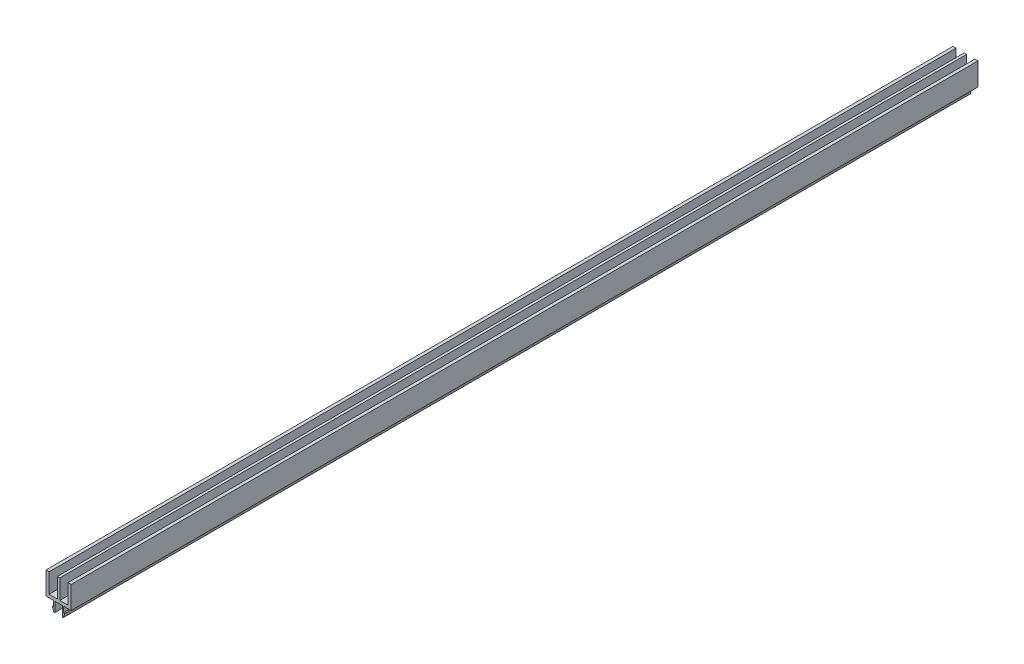
ISO-10303-21;
HEADER;
FILE_DESCRIPTION(('STEP AP214'),'2;1');
FILE_NAME('part.step','',(''),(''),'','','');
FILE_SCHEMA(('AUTOMOTIVE_DESIGN { 1 0 10303 214 1 1 1 1 }'));
ENDSEC;
DATA;
#1=APPLICATION_CONTEXT('core data for automotive mechanical design processes');
#2=APPLICATION_PROTOCOL_DEFINITION('international standard','automotive_design',2000,#1);
#3=PRODUCT_CONTEXT('',#1,'mechanical');
#4=PRODUCT('Part','Part','',(#3));
#5=PRODUCT_RELATED_PRODUCT_CATEGORY('part','',(#4));
#6=PRODUCT_DEFINITION_FORMATION('','',#4);
#7=PRODUCT_DEFINITION_CONTEXT('part definition',#1,'design');
#8=PRODUCT_DEFINITION('design','',#6,#7);
#9=PRODUCT_DEFINITION_SHAPE('','',#8);
#10=(LENGTH_UNIT() NAMED_UNIT(*) SI_UNIT(.MILLI.,.METRE.));
#11=(NAMED_UNIT(*) PLANE_ANGLE_UNIT() SI_UNIT($,.RADIAN.));
#12=(NAMED_UNIT(*) SI_UNIT($,.STERADIAN.) SOLID_ANGLE_UNIT());
#13=UNCERTAINTY_MEASURE_WITH_UNIT(LENGTH_MEASURE(1.E-05),#10,'distance_accuracy_value','');
#14=(GEOMETRIC_REPRESENTATION_CONTEXT(3) GLOBAL_UNCERTAINTY_ASSIGNED_CONTEXT((#13)) GLOBAL_UNIT_ASSIGNED_CONTEXT((#10,
#11,#12)) REPRESENTATION_CONTEXT('',''));
#15=CARTESIAN_POINT('',(0.,0.,0.));
#16=DIRECTION('',(0.,0.,1.));
#17=DIRECTION('',(1.,0.,0.));
#18=AXIS2_PLACEMENT_3D('',#15,#16,#17);
#19=CARTESIAN_POINT('',(-1.,17.9999999975,-672.));
#20=DIRECTION('',(-1.,0.,0.));
#21=DIRECTION('',(0.,-1.,0.));
#22=AXIS2_PLACEMENT_3D('',#19,#20,#21);
#23=PLANE('',#22);
#24=DIRECTION('',(0.,-1.,0.));
#25=VECTOR('',#24,1.);
#26=CARTESIAN_POINT('',(-1.,17.9999999975,50.));
#27=LINE('',#26,#25);
#28=CARTESIAN_POINT('',(-1.,17.9999999975,50.));
#29=VERTEX_POINT('',#28);
#30=CARTESIAN_POINT('',(-1.,2.4999999995,50.));
#31=VERTEX_POINT('',#30);
#32=EDGE_CURVE('E225',#29,#31,#27,.T.);
#33=ORIENTED_EDGE('',*,*,#32,.F.);
#34=DIRECTION('',(0.,0.,1.));
#35=VECTOR('',#34,1.);
#36=CARTESIAN_POINT('',(-1.,17.9999999975,-672.));
#37=LINE('',#36,#35);
#38=CARTESIAN_POINT('',(-1.,17.9999999975,-672.));
#39=VERTEX_POINT('',#38);
#40=EDGE_CURVE('E11',#39,#29,#37,.T.);
#41=ORIENTED_EDGE('',*,*,#40,.F.);
#42=DIRECTION('',(0.,-1.,0.));
#43=VECTOR('',#42,1.);
#44=CARTESIAN_POINT('',(-1.,17.9999999975,-672.));
#45=LINE('',#44,#43);
#46=CARTESIAN_POINT('',(-1.,2.4999999995,-672.));
#47=VERTEX_POINT('',#46);
#48=EDGE_CURVE('E293',#39,#47,#45,.T.);
#49=ORIENTED_EDGE('',*,*,#48,.T.);
#50=DIRECTION('',(0.,0.,1.));
#51=VECTOR('',#50,1.);
#52=CARTESIAN_POINT('',(-1.,2.4999999995,-672.));
#53=LINE('',#52,#51);
#54=EDGE_CURVE('E35',#47,#31,#53,.T.);
#55=ORIENTED_EDGE('',*,*,#54,.T.);
#56=EDGE_LOOP('',(#33,#41,#49,#55));
#57=FACE_BOUND('',#56,.T.);
#58=ADVANCED_FACE('F32',(#57),#23,.T.);
#59=CARTESIAN_POINT('',(0.999999999999998,17.9999999975,-672.));
#60=DIRECTION('',(0.,1.,0.));
#61=DIRECTION('',(0.,0.,1.));
#62=AXIS2_PLACEMENT_3D('',#59,#60,#61);
#63=PLANE('',#62);
#64=DIRECTION('',(-1.,0.,0.));
#65=VECTOR('',#64,1.);
#66=CARTESIAN_POINT('',(0.999999999999998,17.9999999975,50.));
#67=LINE('',#66,#65);
#68=CARTESIAN_POINT('',(0.999999999999998,17.9999999975,50.));
#69=VERTEX_POINT('',#68);
#70=EDGE_CURVE('E291',#69,#29,#67,.T.);
#71=ORIENTED_EDGE('',*,*,#70,.F.);
#72=DIRECTION('',(0.,0.,1.));
#73=VECTOR('',#72,1.);
#74=CARTESIAN_POINT('',(0.999999999999998,17.9999999975,-672.));
#75=LINE('',#74,#73);
#76=CARTESIAN_POINT('',(0.999999999999998,17.9999999975,-672.));
#77=VERTEX_POINT('',#76);
#78=EDGE_CURVE('E41',#77,#69,#75,.T.);
#79=ORIENTED_EDGE('',*,*,#78,.F.);
#80=DIRECTION('',(-1.,0.,0.));
#81=VECTOR('',#80,1.);
#82=CARTESIAN_POINT('',(0.999999999999998,17.9999999975,-672.));
#83=LINE('',#82,#81);
#84=EDGE_CURVE('E215',#77,#39,#83,.T.);
#85=ORIENTED_EDGE('',*,*,#84,.T.);
#86=ORIENTED_EDGE('',*,*,#40,.T.);
#87=EDGE_LOOP('',(#71,#79,#85,#86));
#88=FACE_BOUND('',#87,.T.);
#89=ADVANCED_FACE('F337',(#88),#63,.T.);
#90=CARTESIAN_POINT('',(0.999999999999998,2.4999999995,-672.));
#91=DIRECTION('',(1.,0.,0.));
#92=DIRECTION('',(0.,0.,-1.));
#93=AXIS2_PLACEMENT_3D('',#90,#91,#92);
#94=PLANE('',#93);
#95=DIRECTION('',(0.,1.,0.));
#96=VECTOR('',#95,1.);
#97=CARTESIAN_POINT('',(0.999999999999998,2.4999999995,50.));
#98=LINE('',#97,#96);
#99=CARTESIAN_POINT('',(0.999999999999998,2.4999999995,50.));
#100=VERTEX_POINT('',#99);
#101=EDGE_CURVE('E202',#100,#69,#98,.T.);
#102=ORIENTED_EDGE('',*,*,#101,.F.);
#103=DIRECTION('',(0.,0.,1.));
#104=VECTOR('',#103,1.);
#105=CARTESIAN_POINT('',(0.999999999999998,2.4999999995,-672.));
#106=LINE('',#105,#104);
#107=CARTESIAN_POINT('',(0.999999999999998,2.4999999995,-672.));
#108=VERTEX_POINT('',#107);
#109=EDGE_CURVE('E197',#108,#100,#106,.T.);
#110=ORIENTED_EDGE('',*,*,#109,.F.);
#111=DIRECTION('',(0.,1.,0.));
#112=VECTOR('',#111,1.);
#113=CARTESIAN_POINT('',(0.999999999999998,2.4999999995,-672.));
#114=LINE('',#113,#112);
#115=EDGE_CURVE('E200',#108,#77,#114,.T.);
#116=ORIENTED_EDGE('',*,*,#115,.T.);
#117=ORIENTED_EDGE('',*,*,#78,.T.);
#118=EDGE_LOOP('',(#102,#110,#116,#117));
#119=FACE_BOUND('',#118,.T.);
#120=ADVANCED_FACE('F199',(#119),#94,.T.);
#121=CARTESIAN_POINT('',(7.5,2.4999999995,-672.));
#122=DIRECTION('',(0.,1.,0.));
#123=DIRECTION('',(-1.,0.,0.));
#124=AXIS2_PLACEMENT_3D('',#121,#122,#123);
#125=PLANE('',#124);
#126=DIRECTION('',(-1.,0.,0.));
#127=VECTOR('',#126,1.);
#128=CARTESIAN_POINT('',(7.5,2.4999999995,50.));
#129=LINE('',#128,#127);
#130=CARTESIAN_POINT('',(7.5,2.4999999995,50.));
#131=VERTEX_POINT('',#130);
#132=EDGE_CURVE('E288',#131,#100,#129,.T.);
#133=ORIENTED_EDGE('',*,*,#132,.F.);
#134=DIRECTION('',(0.,0.,1.));
#135=VECTOR('',#134,1.);
#136=CARTESIAN_POINT('',(7.5,2.4999999995,-672.));
#137=LINE('',#136,#135);
#138=CARTESIAN_POINT('',(7.5,2.4999999995,-672.));
#139=VERTEX_POINT('',#138);
#140=EDGE_CURVE('E207',#139,#131,#137,.T.);
#141=ORIENTED_EDGE('',*,*,#140,.F.);
#142=DIRECTION('',(-1.,0.,0.));
#143=VECTOR('',#142,1.);
#144=CARTESIAN_POINT('',(7.5,2.4999999995,-672.));
#145=LINE('',#144,#143);
#146=EDGE_CURVE('E213',#139,#108,#145,.T.);
#147=ORIENTED_EDGE('',*,*,#146,.T.);
#148=ORIENTED_EDGE('',*,*,#109,.T.);
#149=EDGE_LOOP('',(#133,#141,#147,#148));
#150=FACE_BOUND('',#149,.T.);
#151=ADVANCED_FACE('F217',(#150),#125,.T.);
#152=CARTESIAN_POINT('',(7.5,17.9999999975,-672.));
#153=DIRECTION('',(-1.,0.,0.));
#154=DIRECTION('',(0.,-1.,0.));
#155=AXIS2_PLACEMENT_3D('',#152,#153,#154);
#156=PLANE('',#155);
#157=DIRECTION('',(0.,-1.,0.));
#158=VECTOR('',#157,1.);
#159=CARTESIAN_POINT('',(7.5,17.9999999975,50.));
#160=LINE('',#159,#158);
#161=CARTESIAN_POINT('',(7.5,17.9999999975,50.));
#162=VERTEX_POINT('',#161);
#163=EDGE_CURVE('E285',#162,#131,#160,.T.);
#164=ORIENTED_EDGE('',*,*,#163,.F.);
#165=DIRECTION('',(0.,0.,1.));
#166=VECTOR('',#165,1.);
#167=CARTESIAN_POINT('',(7.5,17.9999999975,-672.));
#168=LINE('',#167,#166);
#169=CARTESIAN_POINT('',(7.5,17.9999999975,-672.));
#170=VERTEX_POINT('',#169);
#171=EDGE_CURVE('E297',#170,#162,#168,.T.);
#172=ORIENTED_EDGE('',*,*,#171,.F.);
#173=DIRECTION('',(0.,-1.,0.));
#174=VECTOR('',#173,1.);
#175=CARTESIAN_POINT('',(7.5,17.9999999975,-672.));
#176=LINE('',#175,#174);
#177=EDGE_CURVE('E218',#170,#139,#176,.T.);
#178=ORIENTED_EDGE('',*,*,#177,.T.);
#179=ORIENTED_EDGE('',*,*,#140,.T.);
#180=EDGE_LOOP('',(#164,#172,#178,#179));
#181=FACE_BOUND('',#180,.T.);
#182=ADVANCED_FACE('F350',(#181),#156,.T.);
#183=CARTESIAN_POINT('',(10.,17.9999999975,-672.));
#184=DIRECTION('',(0.,1.,0.));
#185=DIRECTION('',(0.,0.,1.));
#186=AXIS2_PLACEMENT_3D('',#183,#184,#185);
#187=PLANE('',#186);
#188=DIRECTION('',(-1.,0.,0.));
#189=VECTOR('',#188,1.);
#190=CARTESIAN_POINT('',(10.,17.9999999975,50.));
#191=LINE('',#190,#189);
#192=CARTESIAN_POINT('',(10.,17.9999999975,50.));
#193=VERTEX_POINT('',#192);
#194=EDGE_CURVE('E282',#193,#162,#191,.T.);
#195=ORIENTED_EDGE('',*,*,#194,.F.);
#196=DIRECTION('',(0.,0.,1.));
#197=VECTOR('',#196,1.);
#198=CARTESIAN_POINT('',(10.,17.9999999975,-672.));
#199=LINE('',#198,#197);
#200=CARTESIAN_POINT('',(10.,17.9999999975,-672.));
#201=VERTEX_POINT('',#200);
#202=EDGE_CURVE('E299',#201,#193,#199,.T.);
#203=ORIENTED_EDGE('',*,*,#202,.F.);
#204=DIRECTION('',(-1.,0.,0.));
#205=VECTOR('',#204,1.);
#206=CARTESIAN_POINT('',(10.,17.9999999975,-672.));
#207=LINE('',#206,#205);
#208=EDGE_CURVE('E220',#201,#170,#207,.T.);
#209=ORIENTED_EDGE('',*,*,#208,.T.);
#210=ORIENTED_EDGE('',*,*,#171,.T.);
#211=EDGE_LOOP('',(#195,#203,#209,#210));
#212=FACE_BOUND('',#211,.T.);
#213=ADVANCED_FACE('F353',(#212),#187,.T.);
#214=CARTESIAN_POINT('',(10.,-4.99999828349541E-10,-672.));
#215=DIRECTION('',(1.,0.,0.));
#216=DIRECTION('',(0.,0.,-1.));
#217=AXIS2_PLACEMENT_3D('',#214,#215,#216);
#218=PLANE('',#217);
#219=DIRECTION('',(0.,1.,0.));
#220=VECTOR('',#219,1.);
#221=CARTESIAN_POINT('',(10.,-4.99999828349541E-10,50.));
#222=LINE('',#221,#220);
#223=CARTESIAN_POINT('',(10.,-4.99999828349541E-10,50.));
#224=VERTEX_POINT('',#223);
#225=EDGE_CURVE('E279',#224,#193,#222,.T.);
#226=ORIENTED_EDGE('',*,*,#225,.F.);
#227=DIRECTION('',(0.,0.,1.));
#228=VECTOR('',#227,1.);
#229=CARTESIAN_POINT('',(10.,-4.99999828349541E-10,-672.));
#230=LINE('',#229,#228);
#231=CARTESIAN_POINT('',(10.,-4.99999828349541E-10,-672.));
#232=VERTEX_POINT('',#231);
#233=EDGE_CURVE('E301',#232,#224,#230,.T.);
#234=ORIENTED_EDGE('',*,*,#233,.F.);
#235=DIRECTION('',(0.,1.,0.));
#236=VECTOR('',#235,1.);
#237=CARTESIAN_POINT('',(10.,-4.99999828349541E-10,-672.));
#238=LINE('',#237,#236);
#239=EDGE_CURVE('E643',#232,#201,#238,.T.);
#240=ORIENTED_EDGE('',*,*,#239,.T.);
#241=ORIENTED_EDGE('',*,*,#202,.T.);
#242=EDGE_LOOP('',(#226,#234,#240,#241));
#243=FACE_BOUND('',#242,.T.);
#244=ADVANCED_FACE('F357',(#243),#218,.T.);
#245=CARTESIAN_POINT('',(4.,-4.99999998002099E-10,-672.));
#246=DIRECTION('',(0.,-1.,0.));
#247=DIRECTION('',(1.,0.,0.));
#248=AXIS2_PLACEMENT_3D('',#245,#246,#247);
#249=PLANE('',#248);
#250=DIRECTION('',(1.,0.,0.));
#251=VECTOR('',#250,1.);
#252=CARTESIAN_POINT('',(4.,-4.99999998002099E-10,50.));
#253=LINE('',#252,#251);
#254=CARTESIAN_POINT('',(4.,-4.99999998002099E-10,50.));
#255=VERTEX_POINT('',#254);
#256=EDGE_CURVE('E276',#255,#224,#253,.T.);
#257=ORIENTED_EDGE('',*,*,#256,.F.);
#258=DIRECTION('',(0.,0.,1.));
#259=VECTOR('',#258,1.);
#260=CARTESIAN_POINT('',(4.,-4.99999998002099E-10,-672.));
#261=LINE('',#260,#259);
#262=CARTESIAN_POINT('',(4.,-4.99999998002099E-10,-672.));
#263=VERTEX_POINT('',#262);
#264=EDGE_CURVE('E303',#263,#255,#261,.T.);
#265=ORIENTED_EDGE('',*,*,#264,.F.);
#266=DIRECTION('',(1.,0.,0.));
#267=VECTOR('',#266,1.);
#268=CARTESIAN_POINT('',(4.,-4.99999998002099E-10,-672.));
#269=LINE('',#268,#267);
#270=EDGE_CURVE('E647',#263,#232,#269,.T.);
#271=ORIENTED_EDGE('',*,*,#270,.T.);
#272=ORIENTED_EDGE('',*,*,#233,.T.);
#273=EDGE_LOOP('',(#257,#265,#271,#272));
#274=FACE_BOUND('',#273,.T.);
#275=ADVANCED_FACE('F361',(#274),#249,.T.);
#276=CARTESIAN_POINT('',(4.,-4.5,-672.));
#277=DIRECTION('',(1.,0.,0.));
#278=DIRECTION('',(0.,0.,-1.));
#279=AXIS2_PLACEMENT_3D('',#276,#277,#278);
#280=PLANE('',#279);
#281=DIRECTION('',(0.,1.,0.));
#282=VECTOR('',#281,1.);
#283=CARTESIAN_POINT('',(4.,-4.5,50.));
#284=LINE('',#283,#282);
#285=CARTESIAN_POINT('',(4.,-4.5,50.));
#286=VERTEX_POINT('',#285);
#287=EDGE_CURVE('E273',#286,#255,#284,.T.);
#288=ORIENTED_EDGE('',*,*,#287,.F.);
#289=DIRECTION('',(0.,0.,1.));
#290=VECTOR('',#289,1.);
#291=CARTESIAN_POINT('',(4.,-4.5,-672.));
#292=LINE('',#291,#290);
#293=CARTESIAN_POINT('',(4.,-4.5,-672.));
#294=VERTEX_POINT('',#293);
#295=EDGE_CURVE('E305',#294,#286,#292,.T.);
#296=ORIENTED_EDGE('',*,*,#295,.F.);
#297=DIRECTION('',(0.,1.,0.));
#298=VECTOR('',#297,1.);
#299=CARTESIAN_POINT('',(4.,-4.5,-672.));
#300=LINE('',#299,#298);
#301=EDGE_CURVE('E636',#294,#263,#300,.T.);
#302=ORIENTED_EDGE('',*,*,#301,.T.);
#303=ORIENTED_EDGE('',*,*,#264,.T.);
#304=EDGE_LOOP('',(#288,#296,#302,#303));
#305=FACE_BOUND('',#304,.T.);
#306=ADVANCED_FACE('F365',(#305),#280,.T.);
#307=CARTESIAN_POINT('',(5.,-4.5,-672.));
#308=DIRECTION('',(0.,1.,0.));
#309=DIRECTION('',(0.,0.,1.));
#310=AXIS2_PLACEMENT_3D('',#307,#308,#309);
#311=PLANE('',#310);
#312=DIRECTION('',(-1.,0.,0.));
#313=VECTOR('',#312,1.);
#314=CARTESIAN_POINT('',(5.,-4.5,50.));
#315=LINE('',#314,#313);
#316=CARTESIAN_POINT('',(5.,-4.5,50.));
#317=VERTEX_POINT('',#316);
#318=EDGE_CURVE('E270',#317,#286,#315,.T.);
#319=ORIENTED_EDGE('',*,*,#318,.F.);
#320=DIRECTION('',(0.,0.,1.));
#321=VECTOR('',#320,1.);
#322=CARTESIAN_POINT('',(5.,-4.5,-672.));
#323=LINE('',#322,#321);
#324=CARTESIAN_POINT('',(5.,-4.5,-672.));
#325=VERTEX_POINT('',#324);
#326=EDGE_CURVE('E307',#325,#317,#323,.T.);
#327=ORIENTED_EDGE('',*,*,#326,.F.);
#328=DIRECTION('',(-1.,0.,0.));
#329=VECTOR('',#328,1.);
#330=CARTESIAN_POINT('',(5.,-4.5,-672.));
#331=LINE('',#330,#329);
#332=EDGE_CURVE('E632',#325,#294,#331,.T.);
#333=ORIENTED_EDGE('',*,*,#332,.T.);
#334=ORIENTED_EDGE('',*,*,#295,.T.);
#335=EDGE_LOOP('',(#319,#327,#333,#334));
#336=FACE_BOUND('',#335,.T.);
#337=ADVANCED_FACE('F369',(#336),#311,.T.);
#338=CARTESIAN_POINT('',(3.75,-8.,-672.));
#339=DIRECTION('',(0.941741911594837,-0.336336396998156,0.));
#340=DIRECTION('',(0.336336396998157,0.941741911594838,0.));
#341=AXIS2_PLACEMENT_3D('',#338,#339,#340);
#342=PLANE('',#341);
#343=DIRECTION('',(0.336336396998157,0.941741911594837,0.));
#344=VECTOR('',#343,1.);
#345=CARTESIAN_POINT('',(3.75,-8.,50.));
#346=LINE('',#345,#344);
#347=CARTESIAN_POINT('',(3.75,-8.,50.));
#348=VERTEX_POINT('',#347);
#349=EDGE_CURVE('E267',#348,#317,#346,.T.);
#350=ORIENTED_EDGE('',*,*,#349,.F.);
#351=DIRECTION('',(0.,0.,1.));
#352=VECTOR('',#351,1.);
#353=CARTESIAN_POINT('',(3.75,-8.,-672.));
#354=LINE('',#353,#352);
#355=CARTESIAN_POINT('',(3.75,-8.,-672.));
#356=VERTEX_POINT('',#355);
#357=EDGE_CURVE('E309',#356,#348,#354,.T.);
#358=ORIENTED_EDGE('',*,*,#357,.F.);
#359=DIRECTION('',(0.336336396998157,0.941741911594837,0.));
#360=VECTOR('',#359,1.);
#361=CARTESIAN_POINT('',(3.75,-8.,-672.));
#362=LINE('',#361,#360);
#363=EDGE_CURVE('E653',#356,#325,#362,.T.);
#364=ORIENTED_EDGE('',*,*,#363,.T.);
#365=ORIENTED_EDGE('',*,*,#326,.T.);
#366=EDGE_LOOP('',(#350,#358,#364,#365));
#367=FACE_BOUND('',#366,.T.);
#368=ADVANCED_FACE('F373',(#367),#342,.T.);
#369=CARTESIAN_POINT('',(3.,-8.,-672.));
#370=DIRECTION('',(0.,-1.,0.));
#371=DIRECTION('',(0.,0.,-1.));
#372=AXIS2_PLACEMENT_3D('',#369,#370,#371);
#373=PLANE('',#372);
#374=DIRECTION('',(1.,0.,0.));
#375=VECTOR('',#374,1.);
#376=CARTESIAN_POINT('',(3.,-8.,50.));
#377=LINE('',#376,#375);
#378=CARTESIAN_POINT('',(3.,-8.,50.));
#379=VERTEX_POINT('',#378);
#380=EDGE_CURVE('E264',#379,#348,#377,.T.);
#381=ORIENTED_EDGE('',*,*,#380,.F.);
#382=DIRECTION('',(0.,0.,1.));
#383=VECTOR('',#382,1.);
#384=CARTESIAN_POINT('',(3.,-8.,-672.));
#385=LINE('',#384,#383);
#386=CARTESIAN_POINT('',(3.,-8.,-672.));
#387=VERTEX_POINT('',#386);
#388=EDGE_CURVE('E311',#387,#379,#385,.T.);
#389=ORIENTED_EDGE('',*,*,#388,.F.);
#390=DIRECTION('',(1.,0.,0.));
#391=VECTOR('',#390,1.);
#392=CARTESIAN_POINT('',(3.,-8.,-672.));
#393=LINE('',#392,#391);
#394=EDGE_CURVE('E625',#387,#356,#393,.T.);
#395=ORIENTED_EDGE('',*,*,#394,.T.);
#396=ORIENTED_EDGE('',*,*,#357,.T.);
#397=EDGE_LOOP('',(#381,#389,#395,#396));
#398=FACE_BOUND('',#397,.T.);
#399=ADVANCED_FACE('F377',(#398),#373,.T.);
#400=CARTESIAN_POINT('',(3.,-4.9999985194348E-10,-672.));
#401=DIRECTION('',(-1.,0.,0.));
#402=DIRECTION('',(0.,0.,1.));
#403=AXIS2_PLACEMENT_3D('',#400,#401,#402);
#404=PLANE('',#403);
#405=DIRECTION('',(0.,-1.,0.));
#406=VECTOR('',#405,1.);
#407=CARTESIAN_POINT('',(3.,-4.9999985194348E-10,50.));
#408=LINE('',#407,#406);
#409=CARTESIAN_POINT('',(3.,-4.9999985194348E-10,50.));
#410=VERTEX_POINT('',#409);
#411=EDGE_CURVE('E261',#410,#379,#408,.T.);
#412=ORIENTED_EDGE('',*,*,#411,.F.);
#413=DIRECTION('',(0.,0.,1.));
#414=VECTOR('',#413,1.);
#415=CARTESIAN_POINT('',(3.,-4.9999985194348E-10,-672.));
#416=LINE('',#415,#414);
#417=CARTESIAN_POINT('',(3.,-4.9999985194348E-10,-672.));
#418=VERTEX_POINT('',#417);
#419=EDGE_CURVE('E313',#418,#410,#416,.T.);
#420=ORIENTED_EDGE('',*,*,#419,.F.);
#421=DIRECTION('',(0.,-1.,0.));
#422=VECTOR('',#421,1.);
#423=CARTESIAN_POINT('',(3.,-4.9999985194348E-10,-672.));
#424=LINE('',#423,#422);
#425=EDGE_CURVE('E621',#418,#387,#424,.T.);
#426=ORIENTED_EDGE('',*,*,#425,.T.);
#427=ORIENTED_EDGE('',*,*,#388,.T.);
#428=EDGE_LOOP('',(#412,#420,#426,#427));
#429=FACE_BOUND('',#428,.T.);
#430=ADVANCED_FACE('F381',(#429),#404,.T.);
#431=CARTESIAN_POINT('',(-3.,-4.99999455901012E-10,-672.));
#432=DIRECTION('',(0.,-1.,0.));
#433=DIRECTION('',(1.,0.,0.));
#434=AXIS2_PLACEMENT_3D('',#431,#432,#433);
#435=PLANE('',#434);
#436=DIRECTION('',(1.,0.,0.));
#437=VECTOR('',#436,1.);
#438=CARTESIAN_POINT('',(-3.,-4.99999455901012E-10,50.));
#439=LINE('',#438,#437);
#440=CARTESIAN_POINT('',(-3.,-4.99999455901012E-10,50.));
#441=VERTEX_POINT('',#440);
#442=EDGE_CURVE('E258',#441,#410,#439,.T.);
#443=ORIENTED_EDGE('',*,*,#442,.F.);
#444=DIRECTION('',(0.,0.,1.));
#445=VECTOR('',#444,1.);
#446=CARTESIAN_POINT('',(-3.,-4.99999455901012E-10,-672.));
#447=LINE('',#446,#445);
#448=CARTESIAN_POINT('',(-3.,-4.99999455901012E-10,-672.));
#449=VERTEX_POINT('',#448);
#450=EDGE_CURVE('E315',#449,#441,#447,.T.);
#451=ORIENTED_EDGE('',*,*,#450,.F.);
#452=DIRECTION('',(1.,0.,0.));
#453=VECTOR('',#452,1.);
#454=CARTESIAN_POINT('',(-3.,-4.99999455901012E-10,-672.));
#455=LINE('',#454,#453);
#456=EDGE_CURVE('E657',#449,#418,#455,.T.);
#457=ORIENTED_EDGE('',*,*,#456,.T.);
#458=ORIENTED_EDGE('',*,*,#419,.T.);
#459=EDGE_LOOP('',(#443,#451,#457,#458));
#460=FACE_BOUND('',#459,.T.);
#461=ADVANCED_FACE('F385',(#460),#435,.T.);
#462=CARTESIAN_POINT('',(-3.,-8.,-672.));
#463=DIRECTION('',(1.,0.,0.));
#464=DIRECTION('',(0.,0.,-1.));
#465=AXIS2_PLACEMENT_3D('',#462,#463,#464);
#466=PLANE('',#465);
#467=DIRECTION('',(0.,1.,0.));
#468=VECTOR('',#467,1.);
#469=CARTESIAN_POINT('',(-3.,-8.,50.));
#470=LINE('',#469,#468);
#471=CARTESIAN_POINT('',(-3.,-8.,50.));
#472=VERTEX_POINT('',#471);
#473=EDGE_CURVE('E255',#472,#441,#470,.T.);
#474=ORIENTED_EDGE('',*,*,#473,.F.);
#475=DIRECTION('',(0.,0.,1.));
#476=VECTOR('',#475,1.);
#477=CARTESIAN_POINT('',(-3.,-8.,-672.));
#478=LINE('',#477,#476);
#479=CARTESIAN_POINT('',(-3.,-8.,-672.));
#480=VERTEX_POINT('',#479);
#481=EDGE_CURVE('E317',#480,#472,#478,.T.);
#482=ORIENTED_EDGE('',*,*,#481,.F.);
#483=DIRECTION('',(0.,1.,0.));
#484=VECTOR('',#483,1.);
#485=CARTESIAN_POINT('',(-3.,-8.,-672.));
#486=LINE('',#485,#484);
#487=EDGE_CURVE('E614',#480,#449,#486,.T.);
#488=ORIENTED_EDGE('',*,*,#487,.T.);
#489=ORIENTED_EDGE('',*,*,#450,.T.);
#490=EDGE_LOOP('',(#474,#482,#488,#489));
#491=FACE_BOUND('',#490,.T.);
#492=ADVANCED_FACE('F389',(#491),#466,.T.);
#493=CARTESIAN_POINT('',(-3.75,-8.,-672.));
#494=DIRECTION('',(0.,-1.,0.));
#495=DIRECTION('',(0.,0.,-1.));
#496=AXIS2_PLACEMENT_3D('',#493,#494,#495);
#497=PLANE('',#496);
#498=DIRECTION('',(1.,0.,0.));
#499=VECTOR('',#498,1.);
#500=CARTESIAN_POINT('',(-3.75,-8.,50.));
#501=LINE('',#500,#499);
#502=CARTESIAN_POINT('',(-3.75,-8.,50.));
#503=VERTEX_POINT('',#502);
#504=EDGE_CURVE('E252',#503,#472,#501,.T.);
#505=ORIENTED_EDGE('',*,*,#504,.F.);
#506=DIRECTION('',(0.,0.,1.));
#507=VECTOR('',#506,1.);
#508=CARTESIAN_POINT('',(-3.75,-8.,-672.));
#509=LINE('',#508,#507);
#510=CARTESIAN_POINT('',(-3.75,-8.,-672.));
#511=VERTEX_POINT('',#510);
#512=EDGE_CURVE('E319',#511,#503,#509,.T.);
#513=ORIENTED_EDGE('',*,*,#512,.F.);
#514=DIRECTION('',(1.,0.,0.));
#515=VECTOR('',#514,1.);
#516=CARTESIAN_POINT('',(-3.75,-8.,-672.));
#517=LINE('',#516,#515);
#518=EDGE_CURVE('E610',#511,#480,#517,.T.);
#519=ORIENTED_EDGE('',*,*,#518,.T.);
#520=ORIENTED_EDGE('',*,*,#481,.T.);
#521=EDGE_LOOP('',(#505,#513,#519,#520));
#522=FACE_BOUND('',#521,.T.);
#523=ADVANCED_FACE('F393',(#522),#497,.T.);
#524=CARTESIAN_POINT('',(-5.,-4.5,-672.));
#525=DIRECTION('',(-0.941741911594837,-0.336336396998156,0.));
#526=DIRECTION('',(0.336336396998156,-0.941741911594837,0.));
#527=AXIS2_PLACEMENT_3D('',#524,#525,#526);
#528=PLANE('',#527);
#529=DIRECTION('',(0.336336396998156,-0.941741911594837,0.));
#530=VECTOR('',#529,1.);
#531=CARTESIAN_POINT('',(-5.,-4.5,50.));
#532=LINE('',#531,#530);
#533=CARTESIAN_POINT('',(-5.,-4.5,50.));
#534=VERTEX_POINT('',#533);
#535=EDGE_CURVE('E249',#534,#503,#532,.T.);
#536=ORIENTED_EDGE('',*,*,#535,.F.);
#537=DIRECTION('',(0.,0.,1.));
#538=VECTOR('',#537,1.);
#539=CARTESIAN_POINT('',(-5.,-4.5,-672.));
#540=LINE('',#539,#538);
#541=CARTESIAN_POINT('',(-5.,-4.5,-672.));
#542=VERTEX_POINT('',#541);
#543=EDGE_CURVE('E321',#542,#534,#540,.T.);
#544=ORIENTED_EDGE('',*,*,#543,.F.);
#545=DIRECTION('',(0.336336396998156,-0.941741911594837,0.));
#546=VECTOR('',#545,1.);
#547=CARTESIAN_POINT('',(-5.,-4.5,-672.));
#548=LINE('',#547,#546);
#549=EDGE_CURVE('E661',#542,#511,#548,.T.);
#550=ORIENTED_EDGE('',*,*,#549,.T.);
#551=ORIENTED_EDGE('',*,*,#512,.T.);
#552=EDGE_LOOP('',(#536,#544,#550,#551));
#553=FACE_BOUND('',#552,.T.);
#554=ADVANCED_FACE('F397',(#553),#528,.T.);
#555=CARTESIAN_POINT('',(-4.,-4.5,-672.));
#556=DIRECTION('',(0.,1.,0.));
#557=DIRECTION('',(0.,0.,1.));
#558=AXIS2_PLACEMENT_3D('',#555,#556,#557);
#559=PLANE('',#558);
#560=DIRECTION('',(-1.,0.,0.));
#561=VECTOR('',#560,1.);
#562=CARTESIAN_POINT('',(-4.,-4.5,50.));
#563=LINE('',#562,#561);
#564=CARTESIAN_POINT('',(-4.,-4.5,50.));
#565=VERTEX_POINT('',#564);
#566=EDGE_CURVE('E246',#565,#534,#563,.T.);
#567=ORIENTED_EDGE('',*,*,#566,.F.);
#568=DIRECTION('',(0.,0.,1.));
#569=VECTOR('',#568,1.);
#570=CARTESIAN_POINT('',(-4.,-4.5,-672.));
#571=LINE('',#570,#569);
#572=CARTESIAN_POINT('',(-4.,-4.5,-672.));
#573=VERTEX_POINT('',#572);
#574=EDGE_CURVE('E323',#573,#565,#571,.T.);
#575=ORIENTED_EDGE('',*,*,#574,.F.);
#576=DIRECTION('',(-1.,0.,0.));
#577=VECTOR('',#576,1.);
#578=CARTESIAN_POINT('',(-4.,-4.5,-672.));
#579=LINE('',#578,#577);
#580=EDGE_CURVE('E603',#573,#542,#579,.T.);
#581=ORIENTED_EDGE('',*,*,#580,.T.);
#582=ORIENTED_EDGE('',*,*,#543,.T.);
#583=EDGE_LOOP('',(#567,#575,#581,#582));
#584=FACE_BOUND('',#583,.T.);
#585=ADVANCED_FACE('F401',(#584),#559,.T.);
#586=CARTESIAN_POINT('',(-4.,-4.9999985194348E-10,-672.));
#587=DIRECTION('',(-1.,0.,0.));
#588=DIRECTION('',(0.,0.,1.));
#589=AXIS2_PLACEMENT_3D('',#586,#587,#588);
#590=PLANE('',#589);
#591=DIRECTION('',(0.,-1.,0.));
#592=VECTOR('',#591,1.);
#593=CARTESIAN_POINT('',(-4.,-4.9999985194348E-10,50.));
#594=LINE('',#593,#592);
#595=CARTESIAN_POINT('',(-4.,-4.9999985194348E-10,50.));
#596=VERTEX_POINT('',#595);
#597=EDGE_CURVE('E243',#596,#565,#594,.T.);
#598=ORIENTED_EDGE('',*,*,#597,.F.);
#599=DIRECTION('',(0.,0.,1.));
#600=VECTOR('',#599,1.);
#601=CARTESIAN_POINT('',(-4.,-4.9999985194348E-10,-672.));
#602=LINE('',#601,#600);
#603=CARTESIAN_POINT('',(-4.,-4.9999985194348E-10,-672.));
#604=VERTEX_POINT('',#603);
#605=EDGE_CURVE('E325',#604,#596,#602,.T.);
#606=ORIENTED_EDGE('',*,*,#605,.F.);
#607=DIRECTION('',(0.,-1.,0.));
#608=VECTOR('',#607,1.);
#609=CARTESIAN_POINT('',(-4.,-4.9999985194348E-10,-672.));
#610=LINE('',#609,#608);
#611=EDGE_CURVE('E599',#604,#573,#610,.T.);
#612=ORIENTED_EDGE('',*,*,#611,.T.);
#613=ORIENTED_EDGE('',*,*,#574,.T.);
#614=EDGE_LOOP('',(#598,#606,#612,#613));
#615=FACE_BOUND('',#614,.T.);
#616=ADVANCED_FACE('F405',(#615),#590,.T.);
#617=CARTESIAN_POINT('',(-10.,-4.99999719929324E-10,-672.));
#618=DIRECTION('',(0.,-1.,0.));
#619=DIRECTION('',(1.,0.,0.));
#620=AXIS2_PLACEMENT_3D('',#617,#618,#619);
#621=PLANE('',#620);
#622=DIRECTION('',(1.,0.,0.));
#623=VECTOR('',#622,1.);
#624=CARTESIAN_POINT('',(-10.,-4.99999719929324E-10,50.));
#625=LINE('',#624,#623);
#626=CARTESIAN_POINT('',(-10.,-4.99999719929324E-10,50.));
#627=VERTEX_POINT('',#626);
#628=EDGE_CURVE('E240',#627,#596,#625,.T.);
#629=ORIENTED_EDGE('',*,*,#628,.F.);
#630=DIRECTION('',(0.,0.,1.));
#631=VECTOR('',#630,1.);
#632=CARTESIAN_POINT('',(-10.,-4.99999719929324E-10,-672.));
#633=LINE('',#632,#631);
#634=CARTESIAN_POINT('',(-10.,-4.99999719929324E-10,-672.));
#635=VERTEX_POINT('',#634);
#636=EDGE_CURVE('E327',#635,#627,#633,.T.);
#637=ORIENTED_EDGE('',*,*,#636,.F.);
#638=DIRECTION('',(1.,0.,0.));
#639=VECTOR('',#638,1.);
#640=CARTESIAN_POINT('',(-10.,-4.99999719929324E-10,-672.));
#641=LINE('',#640,#639);
#642=EDGE_CURVE('E665',#635,#604,#641,.T.);
#643=ORIENTED_EDGE('',*,*,#642,.T.);
#644=ORIENTED_EDGE('',*,*,#605,.T.);
#645=EDGE_LOOP('',(#629,#637,#643,#644));
#646=FACE_BOUND('',#645,.T.);
#647=ADVANCED_FACE('F409',(#646),#621,.T.);
#648=CARTESIAN_POINT('',(-10.,17.9999999975,-672.));
#649=DIRECTION('',(-1.,0.,0.));
#650=DIRECTION('',(0.,-1.,0.));
#651=AXIS2_PLACEMENT_3D('',#648,#649,#650);
#652=PLANE('',#651);
#653=DIRECTION('',(0.,-1.,0.));
#654=VECTOR('',#653,1.);
#655=CARTESIAN_POINT('',(-10.,17.9999999975,50.));
#656=LINE('',#655,#654);
#657=CARTESIAN_POINT('',(-10.,17.9999999975,50.));
#658=VERTEX_POINT('',#657);
#659=EDGE_CURVE('E237',#658,#627,#656,.T.);
#660=ORIENTED_EDGE('',*,*,#659,.F.);
#661=DIRECTION('',(0.,0.,1.));
#662=VECTOR('',#661,1.);
#663=CARTESIAN_POINT('',(-10.,17.9999999975,-672.));
#664=LINE('',#663,#662);
#665=CARTESIAN_POINT('',(-10.,17.9999999975,-672.));
#666=VERTEX_POINT('',#665);
#667=EDGE_CURVE('E329',#666,#658,#664,.T.);
#668=ORIENTED_EDGE('',*,*,#667,.F.);
#669=DIRECTION('',(0.,-1.,0.));
#670=VECTOR('',#669,1.);
#671=CARTESIAN_POINT('',(-10.,17.9999999975,-672.));
#672=LINE('',#671,#670);
#673=EDGE_CURVE('E592',#666,#635,#672,.T.);
#674=ORIENTED_EDGE('',*,*,#673,.T.);
#675=ORIENTED_EDGE('',*,*,#636,.T.);
#676=EDGE_LOOP('',(#660,#668,#674,#675));
#677=FACE_BOUND('',#676,.T.);
#678=ADVANCED_FACE('F413',(#677),#652,.T.);
#679=CARTESIAN_POINT('',(-7.5,17.9999999975,-672.));
#680=DIRECTION('',(0.,1.,0.));
#681=DIRECTION('',(0.,0.,1.));
#682=AXIS2_PLACEMENT_3D('',#679,#680,#681);
#683=PLANE('',#682);
#684=DIRECTION('',(-1.,0.,0.));
#685=VECTOR('',#684,1.);
#686=CARTESIAN_POINT('',(-7.5,17.9999999975,50.));
#687=LINE('',#686,#685);
#688=CARTESIAN_POINT('',(-7.5,17.9999999975,50.));
#689=VERTEX_POINT('',#688);
#690=EDGE_CURVE('E234',#689,#658,#687,.T.);
#691=ORIENTED_EDGE('',*,*,#690,.F.);
#692=DIRECTION('',(0.,0.,1.));
#693=VECTOR('',#692,1.);
#694=CARTESIAN_POINT('',(-7.5,17.9999999975,-672.));
#695=LINE('',#694,#693);
#696=CARTESIAN_POINT('',(-7.5,17.9999999975,-672.));
#697=VERTEX_POINT('',#696);
#698=EDGE_CURVE('E331',#697,#689,#695,.T.);
#699=ORIENTED_EDGE('',*,*,#698,.F.);
#700=DIRECTION('',(-1.,0.,0.));
#701=VECTOR('',#700,1.);
#702=CARTESIAN_POINT('',(-7.5,17.9999999975,-672.));
#703=LINE('',#702,#701);
#704=EDGE_CURVE('E588',#697,#666,#703,.T.);
#705=ORIENTED_EDGE('',*,*,#704,.T.);
#706=ORIENTED_EDGE('',*,*,#667,.T.);
#707=EDGE_LOOP('',(#691,#699,#705,#706));
#708=FACE_BOUND('',#707,.T.);
#709=ADVANCED_FACE('F417',(#708),#683,.T.);
#710=CARTESIAN_POINT('',(-7.5,2.4999999995,-672.));
#711=DIRECTION('',(1.,0.,0.));
#712=DIRECTION('',(0.,0.,-1.));
#713=AXIS2_PLACEMENT_3D('',#710,#711,#712);
#714=PLANE('',#713);
#715=DIRECTION('',(0.,1.,0.));
#716=VECTOR('',#715,1.);
#717=CARTESIAN_POINT('',(-7.5,2.4999999995,50.));
#718=LINE('',#717,#716);
#719=CARTESIAN_POINT('',(-7.5,2.4999999995,50.));
#720=VERTEX_POINT('',#719);
#721=EDGE_CURVE('E231',#720,#689,#718,.T.);
#722=ORIENTED_EDGE('',*,*,#721,.F.);
#723=DIRECTION('',(0.,0.,1.));
#724=VECTOR('',#723,1.);
#725=CARTESIAN_POINT('',(-7.5,2.4999999995,-672.));
#726=LINE('',#725,#724);
#727=CARTESIAN_POINT('',(-7.5,2.4999999995,-672.));
#728=VERTEX_POINT('',#727);
#729=EDGE_CURVE('E332',#728,#720,#726,.T.);
#730=ORIENTED_EDGE('',*,*,#729,.F.);
#731=DIRECTION('',(0.,1.,0.));
#732=VECTOR('',#731,1.);
#733=CARTESIAN_POINT('',(-7.5,2.4999999995,-672.));
#734=LINE('',#733,#732);
#735=EDGE_CURVE('E669',#728,#697,#734,.T.);
#736=ORIENTED_EDGE('',*,*,#735,.T.);
#737=ORIENTED_EDGE('',*,*,#698,.T.);
#738=EDGE_LOOP('',(#722,#730,#736,#737));
#739=FACE_BOUND('',#738,.T.);
#740=ADVANCED_FACE('F421',(#739),#714,.T.);
#741=CARTESIAN_POINT('',(-1.,2.4999999995,-672.));
#742=DIRECTION('',(0.,1.,0.));
#743=DIRECTION('',(-1.,0.,0.));
#744=AXIS2_PLACEMENT_3D('',#741,#742,#743);
#745=PLANE('',#744);
#746=DIRECTION('',(-1.,0.,0.));
#747=VECTOR('',#746,1.);
#748=CARTESIAN_POINT('',(-1.,2.4999999995,50.));
#749=LINE('',#748,#747);
#750=EDGE_CURVE('E228',#31,#720,#749,.T.);
#751=ORIENTED_EDGE('',*,*,#750,.F.);
#752=ORIENTED_EDGE('',*,*,#54,.F.);
#753=DIRECTION('',(-1.,0.,0.));
#754=VECTOR('',#753,1.);
#755=CARTESIAN_POINT('',(-1.,2.4999999995,-672.));
#756=LINE('',#755,#754);
#757=EDGE_CURVE('E671',#47,#728,#756,.T.);
#758=ORIENTED_EDGE('',*,*,#757,.T.);
#759=ORIENTED_EDGE('',*,*,#729,.T.);
#760=EDGE_LOOP('',(#751,#752,#758,#759));
#761=FACE_BOUND('',#760,.T.);
#762=ADVANCED_FACE('F334',(#761),#745,.T.);
#763=CARTESIAN_POINT('',(0.,0.,-672.));
#764=DIRECTION('',(0.,0.,-1.));
#765=DIRECTION('',(-1.,0.,0.));
#766=AXIS2_PLACEMENT_3D('',#763,#764,#765);
#767=PLANE('',#766);
#768=ORIENTED_EDGE('',*,*,#48,.F.);
#769=ORIENTED_EDGE('',*,*,#84,.F.);
#770=ORIENTED_EDGE('',*,*,#115,.F.);
#771=ORIENTED_EDGE('',*,*,#146,.F.);
#772=ORIENTED_EDGE('',*,*,#177,.F.);
#773=ORIENTED_EDGE('',*,*,#208,.F.);
#774=ORIENTED_EDGE('',*,*,#239,.F.);
#775=ORIENTED_EDGE('',*,*,#270,.F.);
#776=ORIENTED_EDGE('',*,*,#301,.F.);
#777=ORIENTED_EDGE('',*,*,#332,.F.);
#778=ORIENTED_EDGE('',*,*,#363,.F.);
#779=ORIENTED_EDGE('',*,*,#394,.F.);
#780=ORIENTED_EDGE('',*,*,#425,.F.);
#781=ORIENTED_EDGE('',*,*,#456,.F.);
#782=ORIENTED_EDGE('',*,*,#487,.F.);
#783=ORIENTED_EDGE('',*,*,#518,.F.);
#784=ORIENTED_EDGE('',*,*,#549,.F.);
#785=ORIENTED_EDGE('',*,*,#580,.F.);
#786=ORIENTED_EDGE('',*,*,#611,.F.);
#787=ORIENTED_EDGE('',*,*,#642,.F.);
#788=ORIENTED_EDGE('',*,*,#673,.F.);
#789=ORIENTED_EDGE('',*,*,#704,.F.);
#790=ORIENTED_EDGE('',*,*,#735,.F.);
#791=ORIENTED_EDGE('',*,*,#757,.F.);
#792=EDGE_LOOP('',(#768,#769,#770,#771,#772,#773,#774,#775,#776,#777,#778,#779,#780,#781,#782,
#783,#784,#785,#786,#787,#788,#789,#790,#791));
#793=FACE_BOUND('',#792,.T.);
#794=ADVANCED_FACE('F211',(#793),#767,.T.);
#795=CARTESIAN_POINT('',(0.,0.,50.));
#796=DIRECTION('',(0.,0.,-1.));
#797=DIRECTION('',(-1.,0.,0.));
#798=AXIS2_PLACEMENT_3D('',#795,#796,#797);
#799=PLANE('',#798);
#800=ORIENTED_EDGE('',*,*,#32,.T.);
#801=ORIENTED_EDGE('',*,*,#750,.T.);
#802=ORIENTED_EDGE('',*,*,#721,.T.);
#803=ORIENTED_EDGE('',*,*,#690,.T.);
#804=ORIENTED_EDGE('',*,*,#659,.T.);
#805=ORIENTED_EDGE('',*,*,#628,.T.);
#806=ORIENTED_EDGE('',*,*,#597,.T.);
#807=ORIENTED_EDGE('',*,*,#566,.T.);
#808=ORIENTED_EDGE('',*,*,#535,.T.);
#809=ORIENTED_EDGE('',*,*,#504,.T.);
#810=ORIENTED_EDGE('',*,*,#473,.T.);
#811=ORIENTED_EDGE('',*,*,#442,.T.);
#812=ORIENTED_EDGE('',*,*,#411,.T.);
#813=ORIENTED_EDGE('',*,*,#380,.T.);
#814=ORIENTED_EDGE('',*,*,#349,.T.);
#815=ORIENTED_EDGE('',*,*,#318,.T.);
#816=ORIENTED_EDGE('',*,*,#287,.T.);
#817=ORIENTED_EDGE('',*,*,#256,.T.);
#818=ORIENTED_EDGE('',*,*,#225,.T.);
#819=ORIENTED_EDGE('',*,*,#194,.T.);
#820=ORIENTED_EDGE('',*,*,#163,.T.);
#821=ORIENTED_EDGE('',*,*,#132,.T.);
#822=ORIENTED_EDGE('',*,*,#101,.T.);
#823=ORIENTED_EDGE('',*,*,#70,.T.);
#824=EDGE_LOOP('',(#800,#801,#802,#803,#804,#805,#806,#807,#808,#809,#810,#811,#812,#813,#814,
#815,#816,#817,#818,#819,#820,#821,#822,#823));
#825=FACE_BOUND('',#824,.T.);
#826=ADVANCED_FACE('F336',(#825),#799,.F.);
#827=CLOSED_SHELL('',(#58,#89,#120,#151,#182,#213,#244,#275,#306,#337,#368,#399,#430,#461,#492,
#523,#554,#585,#616,#647,#678,#709,#740,#762,#794,#826));
#828=MANIFOLD_SOLID_BREP('B2',#827);
#829=ADVANCED_BREP_SHAPE_REPRESENTATION('',(#18,#828),#14);
#830=SHAPE_DEFINITION_REPRESENTATION(#9,#829);
ENDSEC;
END-ISO-10303-21;
